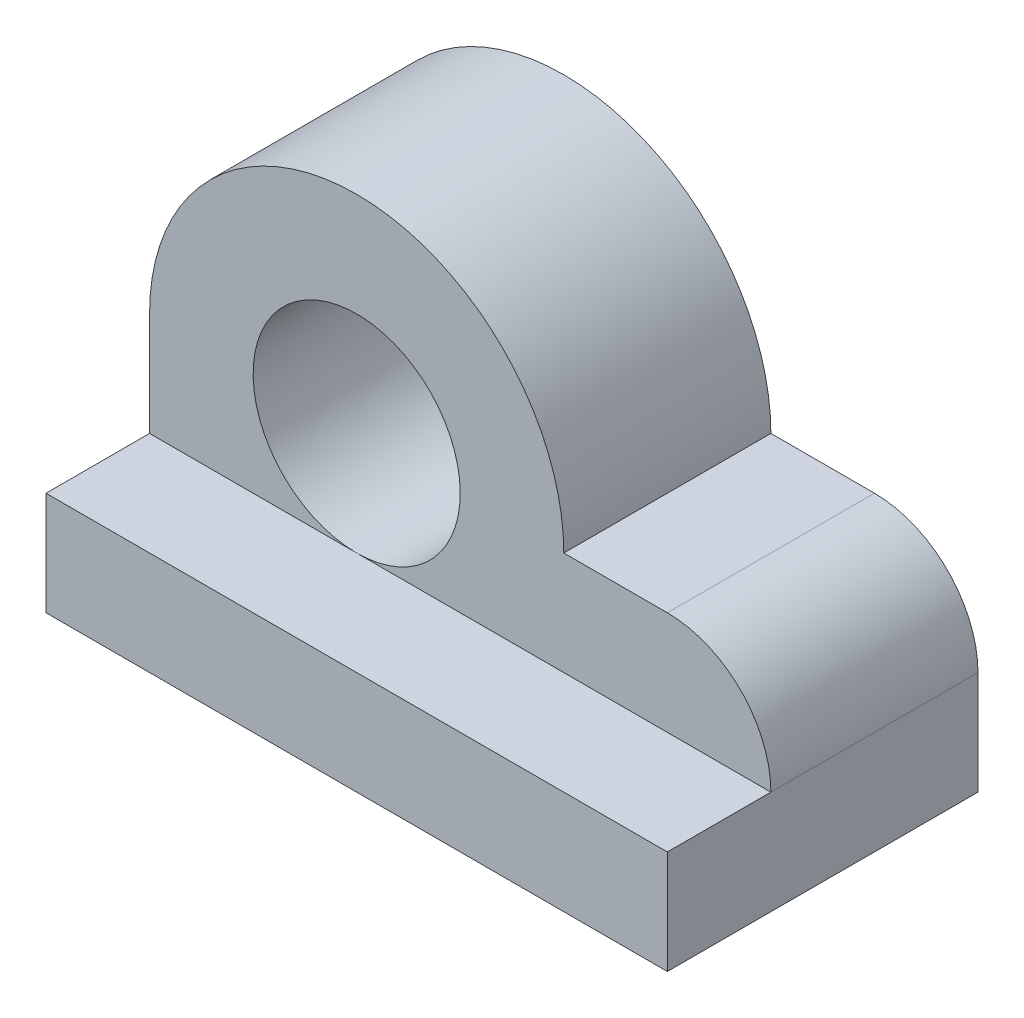
ISO-10303-21;
HEADER;
FILE_DESCRIPTION(('STEP AP214'),'2;1');
FILE_NAME('part.step','',(''),(''),'','','');
FILE_SCHEMA(('AUTOMOTIVE_DESIGN { 1 0 10303 214 1 1 1 1 }'));
ENDSEC;
DATA;
#1=APPLICATION_CONTEXT('core data for automotive mechanical design processes');
#2=APPLICATION_PROTOCOL_DEFINITION('international standard','automotive_design',2000,#1);
#3=PRODUCT_CONTEXT('',#1,'mechanical');
#4=PRODUCT('Part','Part','',(#3));
#5=PRODUCT_RELATED_PRODUCT_CATEGORY('part','',(#4));
#6=PRODUCT_DEFINITION_FORMATION('','',#4);
#7=PRODUCT_DEFINITION_CONTEXT('part definition',#1,'design');
#8=PRODUCT_DEFINITION('design','',#6,#7);
#9=PRODUCT_DEFINITION_SHAPE('','',#8);
#10=(LENGTH_UNIT() NAMED_UNIT(*) SI_UNIT(.MILLI.,.METRE.));
#11=(NAMED_UNIT(*) PLANE_ANGLE_UNIT() SI_UNIT($,.RADIAN.));
#12=(NAMED_UNIT(*) SI_UNIT($,.STERADIAN.) SOLID_ANGLE_UNIT());
#13=UNCERTAINTY_MEASURE_WITH_UNIT(LENGTH_MEASURE(1.E-05),#10,'distance_accuracy_value','');
#14=(GEOMETRIC_REPRESENTATION_CONTEXT(3) GLOBAL_UNCERTAINTY_ASSIGNED_CONTEXT((#13)) GLOBAL_UNIT_ASSIGNED_CONTEXT((#10,
#11,#12)) REPRESENTATION_CONTEXT('',''));
#15=CARTESIAN_POINT('',(0.,0.,0.));
#16=DIRECTION('',(0.,0.,1.));
#17=DIRECTION('',(1.,0.,0.));
#18=AXIS2_PLACEMENT_3D('',#15,#16,#17);
#19=CARTESIAN_POINT('',(0.,0.,30.));
#20=DIRECTION('',(0.,1.,0.));
#21=DIRECTION('',(0.,0.,1.));
#22=AXIS2_PLACEMENT_3D('',#19,#20,#21);
#23=PLANE('',#22);
#24=DIRECTION('',(1.,0.,0.));
#25=VECTOR('',#24,1.);
#26=CARTESIAN_POINT('',(0.,0.,0.));
#27=LINE('',#26,#25);
#28=CARTESIAN_POINT('',(0.,0.,0.));
#29=VERTEX_POINT('',#28);
#30=CARTESIAN_POINT('',(60.,0.,0.));
#31=VERTEX_POINT('',#30);
#32=EDGE_CURVE('E107',#29,#31,#27,.T.);
#33=ORIENTED_EDGE('',*,*,#32,.T.);
#34=DIRECTION('',(0.,0.,-1.));
#35=VECTOR('',#34,1.);
#36=CARTESIAN_POINT('',(60.,0.,30.));
#37=LINE('',#36,#35);
#38=CARTESIAN_POINT('',(60.,0.,30.));
#39=VERTEX_POINT('',#38);
#40=EDGE_CURVE('E160',#39,#31,#37,.T.);
#41=ORIENTED_EDGE('',*,*,#40,.F.);
#42=DIRECTION('',(1.,0.,0.));
#43=VECTOR('',#42,1.);
#44=CARTESIAN_POINT('',(0.,0.,30.));
#45=LINE('',#44,#43);
#46=CARTESIAN_POINT('',(0.,0.,30.));
#47=VERTEX_POINT('',#46);
#48=EDGE_CURVE('E135',#47,#39,#45,.T.);
#49=ORIENTED_EDGE('',*,*,#48,.F.);
#50=DIRECTION('',(0.,0.,-1.));
#51=VECTOR('',#50,1.);
#52=CARTESIAN_POINT('',(0.,0.,30.));
#53=LINE('',#52,#51);
#54=EDGE_CURVE('E147',#47,#29,#53,.T.);
#55=ORIENTED_EDGE('',*,*,#54,.T.);
#56=EDGE_LOOP('',(#33,#41,#49,#55));
#57=FACE_BOUND('',#56,.T.);
#58=ADVANCED_FACE('F33',(#57),#23,.F.);
#59=CARTESIAN_POINT('',(60.,0.,30.));
#60=DIRECTION('',(-1.,0.,0.));
#61=DIRECTION('',(0.,0.,1.));
#62=AXIS2_PLACEMENT_3D('',#59,#60,#61);
#63=PLANE('',#62);
#64=DIRECTION('',(0.,1.,0.));
#65=VECTOR('',#64,1.);
#66=CARTESIAN_POINT('',(60.,0.,0.));
#67=LINE('',#66,#65);
#68=CARTESIAN_POINT('',(60.,10.,0.));
#69=VERTEX_POINT('',#68);
#70=EDGE_CURVE('E150',#31,#69,#67,.T.);
#71=ORIENTED_EDGE('',*,*,#70,.T.);
#72=DIRECTION('',(0.,0.,-1.));
#73=VECTOR('',#72,1.);
#74=CARTESIAN_POINT('',(60.,10.,20.));
#75=LINE('',#74,#73);
#76=CARTESIAN_POINT('',(60.,10.,20.));
#77=VERTEX_POINT('',#76);
#78=EDGE_CURVE('E41',#69,#77,#75,.F.);
#79=ORIENTED_EDGE('',*,*,#78,.T.);
#80=DIRECTION('',(0.,0.,-1.));
#81=VECTOR('',#80,1.);
#82=CARTESIAN_POINT('',(60.,10.,30.));
#83=LINE('',#82,#81);
#84=CARTESIAN_POINT('',(60.,10.,30.));
#85=VERTEX_POINT('',#84);
#86=EDGE_CURVE('E157',#85,#77,#83,.T.);
#87=ORIENTED_EDGE('',*,*,#86,.F.);
#88=DIRECTION('',(0.,1.,0.));
#89=VECTOR('',#88,1.);
#90=CARTESIAN_POINT('',(60.,0.,30.));
#91=LINE('',#90,#89);
#92=EDGE_CURVE('E138',#39,#85,#91,.T.);
#93=ORIENTED_EDGE('',*,*,#92,.F.);
#94=ORIENTED_EDGE('',*,*,#40,.T.);
#95=EDGE_LOOP('',(#71,#79,#87,#93,#94));
#96=FACE_BOUND('',#95,.T.);
#97=ADVANCED_FACE('F169',(#96),#63,.F.);
#98=CARTESIAN_POINT('',(0.,10.,30.));
#99=DIRECTION('',(0.,1.,0.));
#100=DIRECTION('',(0.,0.,1.));
#101=AXIS2_PLACEMENT_3D('',#98,#99,#100);
#102=PLANE('',#101);
#103=DIRECTION('',(1.,0.,0.));
#104=VECTOR('',#103,1.);
#105=CARTESIAN_POINT('',(0.,10.,20.));
#106=LINE('',#105,#104);
#107=CARTESIAN_POINT('',(0.,10.,20.));
#108=VERTEX_POINT('',#107);
#109=CARTESIAN_POINT('',(20.,10.,20.));
#110=VERTEX_POINT('',#109);
#111=EDGE_CURVE('E130',#108,#110,#106,.T.);
#112=ORIENTED_EDGE('',*,*,#111,.F.);
#113=DIRECTION('',(0.,0.,-1.));
#114=VECTOR('',#113,1.);
#115=CARTESIAN_POINT('',(0.,10.,30.));
#116=LINE('',#115,#114);
#117=CARTESIAN_POINT('',(0.,10.,30.));
#118=VERTEX_POINT('',#117);
#119=EDGE_CURVE('E154',#118,#108,#116,.T.);
#120=ORIENTED_EDGE('',*,*,#119,.F.);
#121=DIRECTION('',(1.,0.,0.));
#122=VECTOR('',#121,1.);
#123=CARTESIAN_POINT('',(0.,10.,30.));
#124=LINE('',#123,#122);
#125=EDGE_CURVE('E141',#118,#85,#124,.T.);
#126=ORIENTED_EDGE('',*,*,#125,.T.);
#127=ORIENTED_EDGE('',*,*,#86,.T.);
#128=EDGE_CURVE('E129',#110,#77,#106,.T.);
#129=ORIENTED_EDGE('',*,*,#128,.F.);
#130=EDGE_LOOP('',(#112,#120,#126,#127,#129));
#131=FACE_BOUND('',#130,.T.);
#132=ADVANCED_FACE('F173',(#131),#102,.T.);
#133=CARTESIAN_POINT('',(0.,0.,30.));
#134=DIRECTION('',(-1.,0.,0.));
#135=DIRECTION('',(0.,0.,1.));
#136=AXIS2_PLACEMENT_3D('',#133,#134,#135);
#137=PLANE('',#136);
#138=DIRECTION('',(0.,1.,0.));
#139=VECTOR('',#138,1.);
#140=CARTESIAN_POINT('',(0.,0.,0.));
#141=LINE('',#140,#139);
#142=CARTESIAN_POINT('',(0.,20.,0.));
#143=VERTEX_POINT('',#142);
#144=EDGE_CURVE('E139',#29,#143,#141,.T.);
#145=ORIENTED_EDGE('',*,*,#144,.F.);
#146=ORIENTED_EDGE('',*,*,#54,.F.);
#147=DIRECTION('',(0.,1.,0.));
#148=VECTOR('',#147,1.);
#149=CARTESIAN_POINT('',(0.,0.,30.));
#150=LINE('',#149,#148);
#151=EDGE_CURVE('E144',#47,#118,#150,.T.);
#152=ORIENTED_EDGE('',*,*,#151,.T.);
#153=ORIENTED_EDGE('',*,*,#119,.T.);
#154=DIRECTION('',(0.,1.,0.));
#155=VECTOR('',#154,1.);
#156=CARTESIAN_POINT('',(0.,0.,20.));
#157=LINE('',#156,#155);
#158=CARTESIAN_POINT('',(0.,20.,20.));
#159=VERTEX_POINT('',#158);
#160=EDGE_CURVE('E117',#108,#159,#157,.T.);
#161=ORIENTED_EDGE('',*,*,#160,.T.);
#162=DIRECTION('',(0.,0.,-1.));
#163=VECTOR('',#162,1.);
#164=CARTESIAN_POINT('',(0.,20.,20.));
#165=LINE('',#164,#163);
#166=EDGE_CURVE('E108',#159,#143,#165,.T.);
#167=ORIENTED_EDGE('',*,*,#166,.T.);
#168=EDGE_LOOP('',(#145,#146,#152,#153,#161,#167));
#169=FACE_BOUND('',#168,.T.);
#170=ADVANCED_FACE('F179',(#169),#137,.T.);
#171=CARTESIAN_POINT('',(0.,0.,30.));
#172=DIRECTION('',(0.,0.,1.));
#173=DIRECTION('',(1.,0.,0.));
#174=AXIS2_PLACEMENT_3D('',#171,#172,#173);
#175=PLANE('',#174);
#176=ORIENTED_EDGE('',*,*,#48,.T.);
#177=ORIENTED_EDGE('',*,*,#92,.T.);
#178=ORIENTED_EDGE('',*,*,#125,.F.);
#179=ORIENTED_EDGE('',*,*,#151,.F.);
#180=EDGE_LOOP('',(#176,#177,#178,#179));
#181=FACE_BOUND('',#180,.T.);
#182=ADVANCED_FACE('F182',(#181),#175,.T.);
#183=CARTESIAN_POINT('',(0.,0.,0.));
#184=DIRECTION('',(0.,0.,1.));
#185=DIRECTION('',(1.,0.,0.));
#186=AXIS2_PLACEMENT_3D('',#183,#184,#185);
#187=PLANE('',#186);
#188=CARTESIAN_POINT('',(20.,20.,0.));
#189=DIRECTION('',(0.,0.,1.));
#190=DIRECTION('',(1.,0.,0.));
#191=AXIS2_PLACEMENT_3D('',#188,#189,#190);
#192=CIRCLE('',#191,10.);
#193=CARTESIAN_POINT('',(30.,20.,0.));
#194=VERTEX_POINT('',#193);
#195=EDGE_CURVE('E132',#194,#194,#192,.T.);
#196=ORIENTED_EDGE('',*,*,#195,.T.);
#197=EDGE_LOOP('',(#196));
#198=FACE_BOUND('',#197,.T.);
#199=DIRECTION('',(1.,0.,0.));
#200=VECTOR('',#199,1.);
#201=CARTESIAN_POINT('',(0.,20.,0.));
#202=LINE('',#201,#200);
#203=CARTESIAN_POINT('',(40.,20.,0.));
#204=VERTEX_POINT('',#203);
#205=CARTESIAN_POINT('',(50.,20.,0.));
#206=VERTEX_POINT('',#205);
#207=EDGE_CURVE('E103',#204,#206,#202,.T.);
#208=ORIENTED_EDGE('',*,*,#207,.T.);
#209=CARTESIAN_POINT('',(50.,10.,0.));
#210=DIRECTION('',(0.,0.,1.));
#211=DIRECTION('',(1.,0.,0.));
#212=AXIS2_PLACEMENT_3D('',#209,#210,#211);
#213=CIRCLE('',#212,10.);
#214=EDGE_CURVE('E53',#206,#69,#213,.F.);
#215=ORIENTED_EDGE('',*,*,#214,.T.);
#216=ORIENTED_EDGE('',*,*,#70,.F.);
#217=ORIENTED_EDGE('',*,*,#32,.F.);
#218=ORIENTED_EDGE('',*,*,#144,.T.);
#219=CARTESIAN_POINT('',(20.,20.,0.));
#220=DIRECTION('',(0.,0.,1.));
#221=DIRECTION('',(1.,0.,0.));
#222=AXIS2_PLACEMENT_3D('',#219,#220,#221);
#223=CIRCLE('',#222,20.);
#224=EDGE_CURVE('E122',#204,#143,#223,.T.);
#225=ORIENTED_EDGE('',*,*,#224,.F.);
#226=EDGE_LOOP('',(#208,#215,#216,#217,#218,#225));
#227=FACE_BOUND('',#226,.T.);
#228=ADVANCED_FACE('F175',(#198,#227),#187,.F.);
#229=CARTESIAN_POINT('',(0.,20.,20.));
#230=DIRECTION('',(0.,1.,0.));
#231=DIRECTION('',(0.,0.,1.));
#232=AXIS2_PLACEMENT_3D('',#229,#230,#231);
#233=PLANE('',#232);
#234=DIRECTION('',(1.,0.,0.));
#235=VECTOR('',#234,1.);
#236=CARTESIAN_POINT('',(0.,20.,20.));
#237=LINE('',#236,#235);
#238=CARTESIAN_POINT('',(40.,20.,20.));
#239=VERTEX_POINT('',#238);
#240=CARTESIAN_POINT('',(50.,20.,20.));
#241=VERTEX_POINT('',#240);
#242=EDGE_CURVE('E101',#239,#241,#237,.T.);
#243=ORIENTED_EDGE('',*,*,#242,.T.);
#244=DIRECTION('',(0.,0.,-1.));
#245=VECTOR('',#244,1.);
#246=CARTESIAN_POINT('',(50.,20.,0.));
#247=LINE('',#246,#245);
#248=EDGE_CURVE('E163',#241,#206,#247,.T.);
#249=ORIENTED_EDGE('',*,*,#248,.T.);
#250=ORIENTED_EDGE('',*,*,#207,.F.);
#251=DIRECTION('',(0.,0.,-1.));
#252=VECTOR('',#251,1.);
#253=CARTESIAN_POINT('',(40.,20.,20.));
#254=LINE('',#253,#252);
#255=EDGE_CURVE('E96',#239,#204,#254,.T.);
#256=ORIENTED_EDGE('',*,*,#255,.F.);
#257=EDGE_LOOP('',(#243,#249,#250,#256));
#258=FACE_BOUND('',#257,.T.);
#259=ADVANCED_FACE('F98',(#258),#233,.T.);
#260=CARTESIAN_POINT('',(20.,20.,20.));
#261=DIRECTION('',(0.,0.,-1.));
#262=DIRECTION('',(-1.,0.,0.));
#263=AXIS2_PLACEMENT_3D('',#260,#261,#262);
#264=CYLINDRICAL_SURFACE('',#263,20.);
#265=ORIENTED_EDGE('',*,*,#224,.T.);
#266=ORIENTED_EDGE('',*,*,#166,.F.);
#267=CARTESIAN_POINT('',(20.,20.,20.));
#268=DIRECTION('',(0.,0.,1.));
#269=DIRECTION('',(1.,0.,0.));
#270=AXIS2_PLACEMENT_3D('',#267,#268,#269);
#271=CIRCLE('',#270,20.);
#272=EDGE_CURVE('E111',#239,#159,#271,.T.);
#273=ORIENTED_EDGE('',*,*,#272,.F.);
#274=ORIENTED_EDGE('',*,*,#255,.T.);
#275=EDGE_LOOP('',(#265,#266,#273,#274));
#276=FACE_BOUND('',#275,.T.);
#277=ADVANCED_FACE('F112',(#276),#264,.T.);
#278=CARTESIAN_POINT('',(0.,0.,20.));
#279=DIRECTION('',(0.,0.,1.));
#280=DIRECTION('',(1.,0.,0.));
#281=AXIS2_PLACEMENT_3D('',#278,#279,#280);
#282=PLANE('',#281);
#283=ORIENTED_EDGE('',*,*,#111,.T.);
#284=CARTESIAN_POINT('',(20.,20.,20.));
#285=DIRECTION('',(0.,0.,1.));
#286=DIRECTION('',(1.,0.,0.));
#287=AXIS2_PLACEMENT_3D('',#284,#285,#286);
#288=CIRCLE('',#287,10.);
#289=EDGE_CURVE('E46',#110,#110,#288,.T.);
#290=ORIENTED_EDGE('',*,*,#289,.F.);
#291=ORIENTED_EDGE('',*,*,#128,.T.);
#292=CARTESIAN_POINT('',(50.,10.,20.));
#293=DIRECTION('',(0.,0.,1.));
#294=DIRECTION('',(1.,0.,0.));
#295=AXIS2_PLACEMENT_3D('',#292,#293,#294);
#296=CIRCLE('',#295,10.);
#297=EDGE_CURVE('E11',#77,#241,#296,.T.);
#298=ORIENTED_EDGE('',*,*,#297,.T.);
#299=ORIENTED_EDGE('',*,*,#242,.F.);
#300=ORIENTED_EDGE('',*,*,#272,.T.);
#301=ORIENTED_EDGE('',*,*,#160,.F.);
#302=EDGE_LOOP('',(#283,#290,#291,#298,#299,#300,#301));
#303=FACE_BOUND('',#302,.T.);
#304=ADVANCED_FACE('F120',(#303),#282,.T.);
#305=CARTESIAN_POINT('',(50.,10.,20.));
#306=DIRECTION('',(0.,0.,1.));
#307=DIRECTION('',(1.,0.,0.));
#308=AXIS2_PLACEMENT_3D('',#305,#306,#307);
#309=CYLINDRICAL_SURFACE('',#308,10.);
#310=ORIENTED_EDGE('',*,*,#297,.F.);
#311=ORIENTED_EDGE('',*,*,#78,.F.);
#312=ORIENTED_EDGE('',*,*,#214,.F.);
#313=ORIENTED_EDGE('',*,*,#248,.F.);
#314=EDGE_LOOP('',(#310,#311,#312,#313));
#315=FACE_BOUND('',#314,.T.);
#316=ADVANCED_FACE('F35',(#315),#309,.T.);
#317=CARTESIAN_POINT('',(20.,20.,0.));
#318=DIRECTION('',(0.,0.,1.));
#319=DIRECTION('',(1.,0.,0.));
#320=AXIS2_PLACEMENT_3D('',#317,#318,#319);
#321=CYLINDRICAL_SURFACE('',#320,10.);
#322=ORIENTED_EDGE('',*,*,#195,.F.);
#323=EDGE_LOOP('',(#322));
#324=FACE_BOUND('',#323,.T.);
#325=ORIENTED_EDGE('',*,*,#289,.T.);
#326=EDGE_LOOP('',(#325));
#327=FACE_BOUND('',#326,.T.);
#328=ADVANCED_FACE('F207',(#324,#327),#321,.F.);
#329=CLOSED_SHELL('',(#58,#97,#132,#170,#182,#228,#259,#277,#304,#316,#328));
#330=MANIFOLD_SOLID_BREP('B2',#329);
#331=ADVANCED_BREP_SHAPE_REPRESENTATION('',(#18,#330),#14);
#332=SHAPE_DEFINITION_REPRESENTATION(#9,#331);
ENDSEC;
END-ISO-10303-21;
